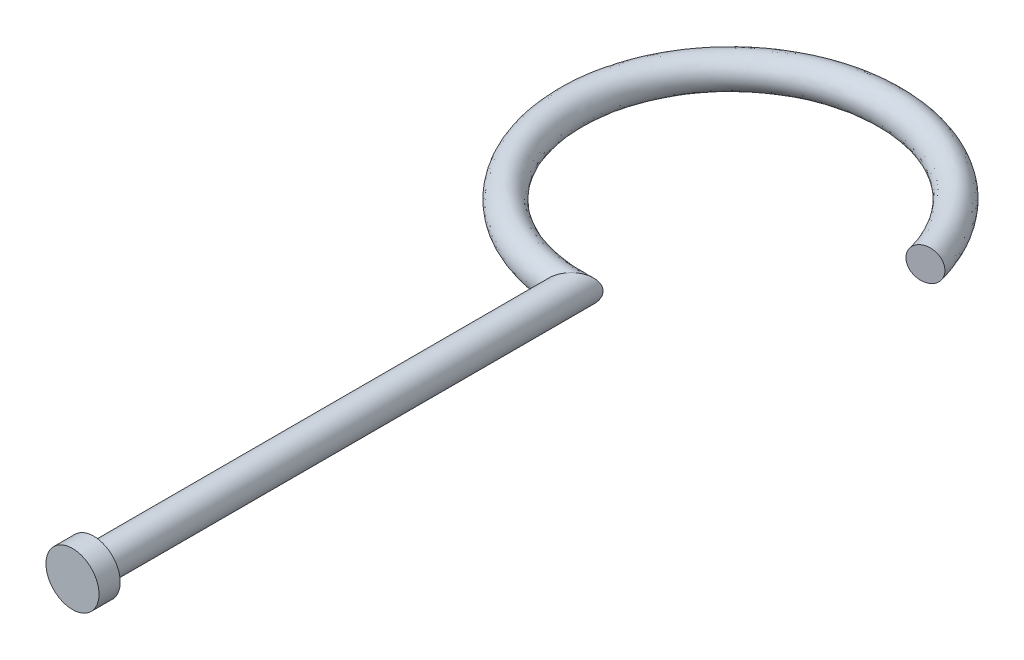
ISO-10303-21;
HEADER;
FILE_DESCRIPTION(('STEP AP214'),'2;1');
FILE_NAME('part.step','',(''),(''),'','','');
FILE_SCHEMA(('AUTOMOTIVE_DESIGN { 1 0 10303 214 1 1 1 1 }'));
ENDSEC;
DATA;
#1=APPLICATION_CONTEXT('core data for automotive mechanical design processes');
#2=APPLICATION_PROTOCOL_DEFINITION('international standard','automotive_design',2000,#1);
#3=PRODUCT_CONTEXT('',#1,'mechanical');
#4=PRODUCT('Part','Part','',(#3));
#5=PRODUCT_RELATED_PRODUCT_CATEGORY('part','',(#4));
#6=PRODUCT_DEFINITION_FORMATION('','',#4);
#7=PRODUCT_DEFINITION_CONTEXT('part definition',#1,'design');
#8=PRODUCT_DEFINITION('design','',#6,#7);
#9=PRODUCT_DEFINITION_SHAPE('','',#8);
#10=(LENGTH_UNIT() NAMED_UNIT(*) SI_UNIT(.MILLI.,.METRE.));
#11=(NAMED_UNIT(*) PLANE_ANGLE_UNIT() SI_UNIT($,.RADIAN.));
#12=(NAMED_UNIT(*) SI_UNIT($,.STERADIAN.) SOLID_ANGLE_UNIT());
#13=UNCERTAINTY_MEASURE_WITH_UNIT(LENGTH_MEASURE(1.E-05),#10,'distance_accuracy_value','');
#14=(GEOMETRIC_REPRESENTATION_CONTEXT(3) GLOBAL_UNCERTAINTY_ASSIGNED_CONTEXT((#13)) GLOBAL_UNIT_ASSIGNED_CONTEXT((#10,
#11,#12)) REPRESENTATION_CONTEXT('',''));
#15=CARTESIAN_POINT('',(0.,0.,0.));
#16=DIRECTION('',(0.,0.,1.));
#17=DIRECTION('',(1.,0.,0.));
#18=AXIS2_PLACEMENT_3D('',#15,#16,#17);
#19=CARTESIAN_POINT('',(14.488887394336,0.,-63.8822856765378));
#20=DIRECTION('',(-0.258819045102522,0.,-0.965925826289068));
#21=DIRECTION('',(-0.965925826289068,0.,0.258819045102522));
#22=AXIS2_PLACEMENT_3D('',#19,#20,#21);
#23=PLANE('',#22);
#24=CARTESIAN_POINT('',(14.488887394336,0.,-63.8822856765378));
#25=DIRECTION('',(-0.258819045102522,0.,-0.965925826289068));
#26=DIRECTION('',(-0.965925826289068,0.,0.258819045102522));
#27=AXIS2_PLACEMENT_3D('',#24,#25,#26);
#28=CIRCLE('',#27,1.5);
#29=CARTESIAN_POINT('',(13.0399986549024,0.,-63.494057108884));
#30=VERTEX_POINT('',#29);
#31=EDGE_CURVE('E68',#30,#30,#28,.T.);
#32=ORIENTED_EDGE('',*,*,#31,.F.);
#33=EDGE_LOOP('',(#32));
#34=FACE_BOUND('',#33,.T.);
#35=ADVANCED_FACE('F48',(#34),#23,.F.);
#36=CARTESIAN_POINT('',(0.,0.,-46.75));
#37=DIRECTION('',(0.,0.,1.));
#38=DIRECTION('',(1.,0.,0.));
#39=AXIS2_PLACEMENT_3D('',#36,#37,#38);
#40=CYLINDRICAL_SURFACE('',#39,1.5);
#41=CARTESIAN_POINT('',(0.,1.5,-45.));
#42=CARTESIAN_POINT('',(-0.00182570052334137,1.49999999062577,-44.9981743226474));
#43=CARTESIAN_POINT('',(-0.00365162674490686,1.49999665772791,-44.9963487601821));
#44=CARTESIAN_POINT('',(-0.117489931101232,1.49958150159555,-44.882554333358));
#45=CARTESIAN_POINT('',(-0.2303222860987,1.48665618338877,-44.7710447599424));
#46=CARTESIAN_POINT('',(-0.454272175423925,1.43418795758808,-44.552083630729));
#47=CARTESIAN_POINT('',(-0.565386324670156,1.39459802315094,-44.4446395992969));
#48=CARTESIAN_POINT('',(-0.747941856520892,1.30290906328869,-44.2697563871826));
#49=CARTESIAN_POINT('',(-0.82110231792989,1.25836622955377,-44.2001513550375));
#50=CARTESIAN_POINT('',(-0.961947015825986,1.15425374697726,-44.0669596414617));
#51=CARTESIAN_POINT('',(-1.02964254951718,1.09471620354097,-44.0033604957694));
#52=CARTESIAN_POINT('',(-1.14180970766872,0.975368406839608,-43.8985550442548));
#53=CARTESIAN_POINT('',(-1.18803773407626,0.918784356712649,-43.8555662520798));
#54=CARTESIAN_POINT('',(-1.27342229000397,0.796212607756046,-43.7764311839189));
#55=CARTESIAN_POINT('',(-1.3125868165649,0.73023569661826,-43.7402771675809));
#56=CARTESIAN_POINT('',(-1.37517690947598,0.602479851345222,-43.6826478737512));
#57=CARTESIAN_POINT('',(-1.40017100820055,0.542140537771701,-43.6596972688418));
#58=CARTESIAN_POINT('',(-1.44248947263902,0.416651098599183,-43.6208961136192));
#59=CARTESIAN_POINT('',(-1.45981845523413,0.3515038965759,-43.605041289281));
#60=CARTESIAN_POINT('',(-1.48569806271902,0.217646824409318,-43.5813804504727));
#61=CARTESIAN_POINT('',(-1.49419915162638,0.14891909886035,-43.5736198541117));
#62=CARTESIAN_POINT('',(-1.50156088721966,0.0105230323150633,-43.5668986619924));
#63=CARTESIAN_POINT('',(-1.50042454795043,-0.0591450077988932,-43.5679353149498));
#64=CARTESIAN_POINT('',(-1.48917422256102,-0.190532277039066,-43.5782087626424));
#65=CARTESIAN_POINT('',(-1.47990407430331,-0.252388682934932,-43.5866748107109));
#66=CARTESIAN_POINT('',(-1.45413471648743,-0.373244096349466,-43.6102421632536));
#67=CARTESIAN_POINT('',(-1.43763479232757,-0.432242820770358,-43.6253441236316));
#68=CARTESIAN_POINT('',(-1.39752974445329,-0.548495868971352,-43.6621228942192));
#69=CARTESIAN_POINT('',(-1.37366263863426,-0.605581314326749,-43.6840424074383));
#70=CARTESIAN_POINT('',(-1.32023815904093,-0.714607500605854,-43.7332319754427));
#71=CARTESIAN_POINT('',(-1.29067319794315,-0.76654124020763,-43.7605091655048));
#72=CARTESIAN_POINT('',(-1.23528297477604,-0.852030583466389,-43.8117648368011));
#73=CARTESIAN_POINT('',(-1.21047906466523,-0.88685742305851,-43.834761645565));
#74=CARTESIAN_POINT('',(-1.1588109674576,-0.95337754731034,-43.8827756593712));
#75=CARTESIAN_POINT('',(-1.13194860155675,-0.98507354638212,-43.9077910794856));
#76=CARTESIAN_POINT('',(-1.04866080811504,-1.07566305513392,-43.9855581206988));
#77=CARTESIAN_POINT('',(-0.989623530943115,-1.12992509835099,-44.0409485388455));
#78=CARTESIAN_POINT('',(-0.845490470355652,-1.24349263804372,-44.1769569756725));
#79=CARTESIAN_POINT('',(-0.758509137962945,-1.29791007116603,-44.2596167892086));
#80=CARTESIAN_POINT('',(-0.58020985343793,-1.38683041587513,-44.4304562635119));
#81=CARTESIAN_POINT('',(-0.488889657270904,-1.42132289834311,-44.518638788261));
#82=CARTESIAN_POINT('',(-0.26707263648279,-1.48212334379867,-44.7347735128394));
#83=CARTESIAN_POINT('',(-0.135634130107034,-1.49951509866013,-44.8644173627262));
#84=CARTESIAN_POINT('',(-0.00365159196749037,-1.49999666112362,-44.9963487916517));
#85=CARTESIAN_POINT('',(-0.00182566537006766,-1.49999999403207,-44.9981743544482));
#86=CARTESIAN_POINT('',(0.,-1.5,-45.));
#87=B_SPLINE_CURVE_WITH_KNOTS('',3,(#41,#42,#43,#44,#45,#46,#47,#48,#49,#50,#51,#52,#53,#54,#55,
#56,#57,#58,#59,#60,#61,#62,#63,#64,#65,#66,#67,#68,#69,#70,#71,#72,#73,#74,#75,#76,#77,#78,#79,
#80,#81,#82,#83,#84,#85,#86),.UNSPECIFIED.,.F.,.F.,(4,2,2,2,2,2,2,2,2,2,2,2,2,2,2,2,2,2,2,2,2,2,
4),(0.,0.00774597318277118,0.482869010134793,0.958832195993624,1.2888740020107,1.61821507035054,
1.87164184673813,2.12477987622606,2.33161459410611,2.53832456032036,2.74618827191288,
2.95398697783926,3.14248101672373,3.33099369084034,3.5271831640456,3.72363571317399,
3.86909372837129,4.01442450492916,4.30561829419841,4.69878445153205,5.09215621388458,
5.64423115695127,5.65197713013404),.UNSPECIFIED.);
#88=CARTESIAN_POINT('',(0.,1.5,-45.));
#89=VERTEX_POINT('',#88);
#90=CARTESIAN_POINT('',(0.,-1.5,-45.));
#91=VERTEX_POINT('',#90);
#92=EDGE_CURVE('E56',#89,#91,#87,.T.);
#93=ORIENTED_EDGE('',*,*,#92,.T.);
#94=CARTESIAN_POINT('',(0.,1.5,-45.));
#95=CARTESIAN_POINT('',(0.001825706863768,1.49999998989187,-45.0018256764312));
#96=CARTESIAN_POINT('',(0.00365146612070713,1.49999665701054,-45.0036514056455));
#97=CARTESIAN_POINT('',(0.120599320399947,1.49957024430724,-45.1205973603444));
#98=CARTESIAN_POINT('',(0.235901321708843,1.4859341178295,-45.2358990268935));
#99=CARTESIAN_POINT('',(0.463524269408615,1.43139410815715,-45.4635224668043));
#100=CARTESIAN_POINT('',(0.575838604769265,1.39043426275258,-45.5758376315238));
#101=CARTESIAN_POINT('',(0.760142278275618,1.29592445644127,-45.7601420861801));
#102=CARTESIAN_POINT('',(0.83406529974933,1.24991369989728,-45.8340652488425));
#103=CARTESIAN_POINT('',(0.976041292392693,1.14247301490139,-45.9760413431842));
#104=CARTESIAN_POINT('',(1.04410717856905,1.08107824292301,-46.0441071902788));
#105=CARTESIAN_POINT('',(1.15484548953128,0.959803898015554,-46.1548454808439));
#106=CARTESIAN_POINT('',(1.19953762618266,0.903623381138479,-46.1995376238736));
#107=CARTESIAN_POINT('',(1.2821472743883,0.781974462821362,-46.2821472766948));
#108=CARTESIAN_POINT('',(1.32007212858262,0.7165162679866,-46.3200721291351));
#109=CARTESIAN_POINT('',(1.38007136041,0.590949858775834,-46.3800713599689));
#110=CARTESIAN_POINT('',(1.40379995732907,0.532428311271976,-46.4037999572123));
#111=CARTESIAN_POINT('',(1.4441053813628,0.410670435316418,-46.4441053814793));
#112=CARTESIAN_POINT('',(1.46069467467753,0.347442553150832,-46.4606946747036));
#113=CARTESIAN_POINT('',(1.48196042918561,0.236631128045975,-46.481960429167));
#114=CARTESIAN_POINT('',(1.48869626595374,0.189826484297172,-46.488696265949));
#115=CARTESIAN_POINT('',(1.49771816991374,0.0953555933874125,-46.4977181699185));
#116=CARTESIAN_POINT('',(1.50000365125669,0.0476892336228323,-46.5000036512571));
#117=CARTESIAN_POINT('',(1.49999487961782,-0.0668775507450523,-46.4999948796172));
#118=CARTESIAN_POINT('',(1.49548790962511,-0.133800085633828,-46.4954879096317));
#119=CARTESIAN_POINT('',(1.47784073011761,-0.26534504488404,-46.4778407301109));
#120=CARTESIAN_POINT('',(1.46469020647034,-0.329964623948658,-46.4646902064431));
#121=CARTESIAN_POINT('',(1.43090224926875,-0.454601802665413,-46.4309022492957));
#122=CARTESIAN_POINT('',(1.41031589857866,-0.514647495680266,-46.4103158986798));
#123=CARTESIAN_POINT('',(1.36291764091198,-0.629544682950523,-46.3629176408107));
#124=CARTESIAN_POINT('',(1.3361034103921,-0.68439422780926,-46.3361034100142));
#125=CARTESIAN_POINT('',(1.26547213238862,-0.809727663998072,-46.2654721329211));
#126=CARTESIAN_POINT('',(1.21918683411052,-0.877428404744583,-46.2191868364754));
#127=CARTESIAN_POINT('',(1.11955048041993,-1.00148295189705,-46.1195504780497));
#128=CARTESIAN_POINT('',(1.06618374451279,-1.05781085631716,-46.0661837355562));
#129=CARTESIAN_POINT('',(0.930122123424716,-1.18179787720656,-45.9301221362889));
#130=CARTESIAN_POINT('',(0.844789880161585,-1.24367891143176,-45.8447899379537));
#131=CARTESIAN_POINT('',(0.668270243538632,-1.3468131564453,-45.6682697491874));
#132=CARTESIAN_POINT('',(0.577075316095577,-1.3880392006567,-45.5770742238307));
#133=CARTESIAN_POINT('',(0.327635851256353,-1.47307422600255,-45.3276335285106));
#134=CARTESIAN_POINT('',(0.166150375926888,-1.49940416860583,-45.1661476760354));
#135=CARTESIAN_POINT('',(0.00365140600613388,-1.49999665709837,-45.0036513455313));
#136=CARTESIAN_POINT('',(0.00182564627826326,-1.49999998987666,-45.0018256158461));
#137=CARTESIAN_POINT('',(0.,-1.5,-45.));
#138=B_SPLINE_CURVE_WITH_KNOTS('',3,(#94,#95,#96,#97,#98,#99,#100,#101,#102,#103,#104,#105,#106,
#107,#108,#109,#110,#111,#112,#113,#114,#115,#116,#117,#118,#119,#120,#121,#122,#123,#124,#125,
#126,#127,#128,#129,#130,#131,#132,#133,#134,#135,#136,#137),.UNSPECIFIED.,.F.,.F.,(4,2,2,2,2,2,
2,2,2,2,2,2,2,2,2,2,2,2,2,2,2,4),(0.,0.00774597314808132,0.496151109762397,0.985559641731343,
1.32714991491832,1.66796657349027,1.9208153044483,2.17338799869317,2.37498405365203,
2.57622665180979,2.7191252400906,2.86204263840295,3.06246451210251,3.26312597936895,
3.46243436798044,3.66181723582025,3.94276346053963,4.22434250503702,4.62877031946119,
5.03372867225369,5.7153616560804,5.72310762922849),.UNSPECIFIED.);
#139=EDGE_CURVE('E12',#89,#91,#138,.T.);
#140=ORIENTED_EDGE('',*,*,#139,.F.);
#141=EDGE_LOOP('',(#93,#140));
#142=FACE_BOUND('',#141,.T.);
#143=CARTESIAN_POINT('',(0.,0.,0.));
#144=DIRECTION('',(0.,0.,1.));
#145=DIRECTION('',(1.,0.,0.));
#146=AXIS2_PLACEMENT_3D('',#143,#144,#145);
#147=CIRCLE('',#146,1.5);
#148=CARTESIAN_POINT('',(1.50000000000002,0.,0.));
#149=VERTEX_POINT('',#148);
#150=EDGE_CURVE('E51',#149,#149,#147,.T.);
#151=ORIENTED_EDGE('',*,*,#150,.F.);
#152=EDGE_LOOP('',(#151));
#153=FACE_BOUND('',#152,.T.);
#154=ADVANCED_FACE('F63',(#142,#153),#40,.T.);
#155=CARTESIAN_POINT('',(13.0399986549024,0.,-63.494057108884));
#156=CARTESIAN_POINT('',(12.3915900467848,0.,-65.9139509781398));
#157=CARTESIAN_POINT('',(11.0556787281085,0.,-68.1418216762766));
#158=CARTESIAN_POINT('',(7.40131342650905,0.,-71.5645082865649));
#159=CARTESIAN_POINT('',(5.08907231112321,0.,-72.7522012146168));
#160=CARTESIAN_POINT('',(0.178366383312261,0.,-73.7290013562704));
#161=CARTESIAN_POINT('',(-2.41237617793993,0.,-73.5165725678967));
#162=CARTESIAN_POINT('',(-7.09837511593334,0.,-71.7528874545511));
#163=CARTESIAN_POINT('',(-9.1862625370105,0.,-70.2044046081781));
#164=CARTESIAN_POINT('',(-12.2342776508528,0.,-66.2321539750573));
#165=CARTESIAN_POINT('',(-13.1896121951202,0.,-63.8146327409798));
#166=CARTESIAN_POINT('',(-13.6803754250291,0.,-58.8318300479183));
#167=CARTESIAN_POINT('',(-13.2150323621459,0.,-56.2743842825794));
#168=CARTESIAN_POINT('',(-11.0005316592367,0.,-51.7838210815076));
#169=CARTESIAN_POINT('',(-9.2548563487766,0.,-49.8577652210747));
#170=CARTESIAN_POINT('',(-6.06594580128167,0.,-47.8747732135494));
#171=CARTESIAN_POINT('',(-4.91118289785517,0.,-47.362866504004));
#172=CARTESIAN_POINT('',(-3.10576539447972,0.,-46.8472080367964));
#173=CARTESIAN_POINT('',(-2.49195556552076,0.,-46.7172317433738));
#174=CARTESIAN_POINT('',(-1.56214768113099,0.,-46.5870346903721));
#175=CARTESIAN_POINT('',(-1.25069628392961,0.,-46.5544159312952));
#176=CARTESIAN_POINT('',(-0.626200605762738,0.,-46.5108990312765));
#177=CARTESIAN_POINT('',(-0.330554881620393,0.,-46.5000052192853));
#178=CARTESIAN_POINT('',(0.277083285934351,0.,-46.4999956250027));
#179=CARTESIAN_POINT('',(0.583333333333369,0.,-46.5));
#180=CARTESIAN_POINT('',(1.16666666666651,0.,-46.5));
#181=CARTESIAN_POINT('',(1.45833333333141,0.,-46.5));
#182=CARTESIAN_POINT('',(1.75,0.,-46.5));
#183=CARTESIAN_POINT('',(13.0399986549024,3.,-63.494057108884));
#184=CARTESIAN_POINT('',(12.3915900467848,3.,-65.9139509781398));
#185=CARTESIAN_POINT('',(11.0556787281085,3.,-68.1418216762766));
#186=CARTESIAN_POINT('',(7.40131342650906,3.,-71.5645082865649));
#187=CARTESIAN_POINT('',(5.08907231112321,3.,-72.7522012146168));
#188=CARTESIAN_POINT('',(0.178366383312261,3.,-73.7290013562704));
#189=CARTESIAN_POINT('',(-2.41237617793993,3.,-73.5165725678967));
#190=CARTESIAN_POINT('',(-7.09837511593334,3.,-71.7528874545511));
#191=CARTESIAN_POINT('',(-9.1862625370105,3.,-70.2044046081781));
#192=CARTESIAN_POINT('',(-12.2342776508528,3.,-66.2321539750573));
#193=CARTESIAN_POINT('',(-13.1896121951202,3.,-63.8146327409798));
#194=CARTESIAN_POINT('',(-13.6803754250291,3.,-58.8318300479183));
#195=CARTESIAN_POINT('',(-13.2150323621459,3.,-56.2743842825794));
#196=CARTESIAN_POINT('',(-11.0005316592367,3.,-51.7838210815076));
#197=CARTESIAN_POINT('',(-9.2548563487766,3.,-49.8577652210747));
#198=CARTESIAN_POINT('',(-6.06594580128167,3.,-47.8747732135494));
#199=CARTESIAN_POINT('',(-4.91118289785517,3.,-47.362866504004));
#200=CARTESIAN_POINT('',(-3.10576539447972,3.,-46.8472080367964));
#201=CARTESIAN_POINT('',(-2.49195556552076,3.,-46.7172317433738));
#202=CARTESIAN_POINT('',(-1.56214768113099,3.,-46.5870346903721));
#203=CARTESIAN_POINT('',(-1.25069628392961,3.,-46.5544159312952));
#204=CARTESIAN_POINT('',(-0.626200605762738,3.,-46.5108990312765));
#205=CARTESIAN_POINT('',(-0.330554881620393,3.,-46.5000052192853));
#206=CARTESIAN_POINT('',(0.277083285934351,3.,-46.4999956250027));
#207=CARTESIAN_POINT('',(0.583333333333369,3.,-46.5));
#208=CARTESIAN_POINT('',(1.16666666666651,3.,-46.5));
#209=CARTESIAN_POINT('',(1.45833333333141,3.,-46.5));
#210=CARTESIAN_POINT('',(1.75,3.,-46.5));
#211=CARTESIAN_POINT('',(15.9377761337696,3.,-64.2705142441916));
#212=CARTESIAN_POINT('',(15.1452767238444,3.,-67.2281623065489));
#213=CARTESIAN_POINT('',(13.5124962232378,3.,-69.9511153821159));
#214=CARTESIAN_POINT('',(9.04604974351696,3.,-74.1343990169127));
#215=CARTESIAN_POINT('',(6.21997726914843,3.,-75.5860237067817));
#216=CARTESIAN_POINT('',(0.218003357383784,3.,-76.7798905465249));
#217=CARTESIAN_POINT('',(-2.94845977302485,3.,-76.5202553607455));
#218=CARTESIAN_POINT('',(-8.67579180837586,3.,-74.3646402222463));
#219=CARTESIAN_POINT('',(-11.2276542118964,3.,-72.4720500766815));
#220=CARTESIAN_POINT('',(-14.9530060177144,3.,-67.6170770806063));
#221=CARTESIAN_POINT('',(-16.120637127366,3.,-64.6623289056248));
#222=CARTESIAN_POINT('',(-16.7204588528166,3.,-58.5722367252506));
#223=CARTESIAN_POINT('',(-16.1517062204053,3.,-55.4464696787211));
#224=CARTESIAN_POINT('',(-13.4450942501734,3.,-49.9580035440519));
#225=CARTESIAN_POINT('',(-11.3114910929556,3.,-47.6039352701981));
#226=CARTESIAN_POINT('',(-7.41393375711881,3.,-45.1802783721181));
#227=CARTESIAN_POINT('',(-6.00255687515042,3.,-44.5546146160108));
#228=CARTESIAN_POINT('',(-3.79593548214482,3.,-43.9243653783038));
#229=CARTESIAN_POINT('',(-3.04572346896981,3.,-43.7655054641262));
#230=CARTESIAN_POINT('',(-1.90929161027119,3.,-43.6063757326756));
#231=CARTESIAN_POINT('',(-1.52862879146964,3.,-43.566508360473));
#232=CARTESIAN_POINT('',(-0.765356295932082,3.,-43.5133210382258));
#233=CARTESIAN_POINT('',(-0.365350125704776,3.,-43.5000063791261));
#234=CARTESIAN_POINT('',(0.306249942068836,3.,-43.4999946527814));
#235=CARTESIAN_POINT('',(0.583333333333383,3.,-43.5));
#236=CARTESIAN_POINT('',(1.16666666666652,3.,-43.5));
#237=CARTESIAN_POINT('',(1.45833333333142,3.,-43.5));
#238=CARTESIAN_POINT('',(1.75000000000002,3.,-43.5));
#239=CARTESIAN_POINT('',(15.9377761337696,0.,-64.2705142441916));
#240=CARTESIAN_POINT('',(15.1452767238444,0.,-67.2281623065489));
#241=CARTESIAN_POINT('',(13.5124962232378,0.,-69.9511153821159));
#242=CARTESIAN_POINT('',(9.04604974351696,0.,-74.1343990169127));
#243=CARTESIAN_POINT('',(6.21997726914843,0.,-75.5860237067817));
#244=CARTESIAN_POINT('',(0.218003357383784,0.,-76.7798905465249));
#245=CARTESIAN_POINT('',(-2.94845977302485,0.,-76.5202553607455));
#246=CARTESIAN_POINT('',(-8.67579180837586,0.,-74.3646402222463));
#247=CARTESIAN_POINT('',(-11.2276542118964,0.,-72.4720500766815));
#248=CARTESIAN_POINT('',(-14.9530060177144,0.,-67.6170770806063));
#249=CARTESIAN_POINT('',(-16.120637127366,0.,-64.6623289056248));
#250=CARTESIAN_POINT('',(-16.7204588528166,0.,-58.5722367252506));
#251=CARTESIAN_POINT('',(-16.1517062204053,0.,-55.4464696787211));
#252=CARTESIAN_POINT('',(-13.4450942501734,0.,-49.9580035440519));
#253=CARTESIAN_POINT('',(-11.3114910929556,0.,-47.6039352701981));
#254=CARTESIAN_POINT('',(-7.41393375711881,0.,-45.1802783721181));
#255=CARTESIAN_POINT('',(-6.00255687515042,0.,-44.5546146160108));
#256=CARTESIAN_POINT('',(-3.79593548214482,0.,-43.9243653783038));
#257=CARTESIAN_POINT('',(-3.04572346896981,0.,-43.7655054641262));
#258=CARTESIAN_POINT('',(-1.90929161027119,0.,-43.6063757326756));
#259=CARTESIAN_POINT('',(-1.52862879146964,0.,-43.566508360473));
#260=CARTESIAN_POINT('',(-0.765356295932082,0.,-43.5133210382258));
#261=CARTESIAN_POINT('',(-0.365350125704776,0.,-43.5000063791261));
#262=CARTESIAN_POINT('',(0.306249942068836,0.,-43.4999946527814));
#263=CARTESIAN_POINT('',(0.583333333333383,0.,-43.5));
#264=CARTESIAN_POINT('',(1.16666666666652,0.,-43.5));
#265=CARTESIAN_POINT('',(1.45833333333142,0.,-43.5));
#266=CARTESIAN_POINT('',(1.75000000000002,0.,-43.5));
#267=CARTESIAN_POINT('',(15.9377761337696,-3.,-64.2705142441916));
#268=CARTESIAN_POINT('',(15.1452767238444,-3.,-67.2281623065489));
#269=CARTESIAN_POINT('',(13.5124962232378,-3.,-69.9511153821159));
#270=CARTESIAN_POINT('',(9.04604974351696,-3.,-74.1343990169127));
#271=CARTESIAN_POINT('',(6.21997726914843,-3.,-75.5860237067817));
#272=CARTESIAN_POINT('',(0.218003357383784,-3.,-76.7798905465249));
#273=CARTESIAN_POINT('',(-2.94845977302485,-3.,-76.5202553607455));
#274=CARTESIAN_POINT('',(-8.67579180837586,-3.,-74.3646402222463));
#275=CARTESIAN_POINT('',(-11.2276542118964,-3.,-72.4720500766815));
#276=CARTESIAN_POINT('',(-14.9530060177144,-3.,-67.6170770806063));
#277=CARTESIAN_POINT('',(-16.120637127366,-3.,-64.6623289056248));
#278=CARTESIAN_POINT('',(-16.7204588528166,-3.,-58.5722367252506));
#279=CARTESIAN_POINT('',(-16.1517062204053,-3.,-55.4464696787211));
#280=CARTESIAN_POINT('',(-13.4450942501734,-3.,-49.9580035440519));
#281=CARTESIAN_POINT('',(-11.3114910929556,-3.,-47.6039352701981));
#282=CARTESIAN_POINT('',(-7.41393375711881,-3.,-45.1802783721181));
#283=CARTESIAN_POINT('',(-6.00255687515042,-3.,-44.5546146160108));
#284=CARTESIAN_POINT('',(-3.79593548214482,-3.,-43.9243653783038));
#285=CARTESIAN_POINT('',(-3.04572346896981,-3.,-43.7655054641262));
#286=CARTESIAN_POINT('',(-1.90929161027119,-3.,-43.6063757326756));
#287=CARTESIAN_POINT('',(-1.52862879146964,-3.,-43.566508360473));
#288=CARTESIAN_POINT('',(-0.765356295932082,-3.,-43.5133210382258));
#289=CARTESIAN_POINT('',(-0.365350125704776,-3.,-43.5000063791261));
#290=CARTESIAN_POINT('',(0.306249942068836,-3.,-43.4999946527814));
#291=CARTESIAN_POINT('',(0.583333333333383,-3.,-43.5));
#292=CARTESIAN_POINT('',(1.16666666666652,-3.,-43.5));
#293=CARTESIAN_POINT('',(1.45833333333142,-3.,-43.5));
#294=CARTESIAN_POINT('',(1.75000000000002,-3.,-43.5));
#295=CARTESIAN_POINT('',(13.0399986549024,-3.,-63.494057108884));
#296=CARTESIAN_POINT('',(12.3915900467848,-3.,-65.9139509781398));
#297=CARTESIAN_POINT('',(11.0556787281085,-3.,-68.1418216762766));
#298=CARTESIAN_POINT('',(7.40131342650906,-3.,-71.5645082865649));
#299=CARTESIAN_POINT('',(5.08907231112321,-3.,-72.7522012146168));
#300=CARTESIAN_POINT('',(0.178366383312261,-3.,-73.7290013562704));
#301=CARTESIAN_POINT('',(-2.41237617793993,-3.,-73.5165725678967));
#302=CARTESIAN_POINT('',(-7.09837511593334,-3.,-71.7528874545511));
#303=CARTESIAN_POINT('',(-9.1862625370105,-3.,-70.2044046081781));
#304=CARTESIAN_POINT('',(-12.2342776508528,-3.,-66.2321539750573));
#305=CARTESIAN_POINT('',(-13.1896121951202,-3.,-63.8146327409798));
#306=CARTESIAN_POINT('',(-13.6803754250291,-3.,-58.8318300479183));
#307=CARTESIAN_POINT('',(-13.2150323621459,-3.,-56.2743842825794));
#308=CARTESIAN_POINT('',(-11.0005316592367,-3.,-51.7838210815076));
#309=CARTESIAN_POINT('',(-9.2548563487766,-3.,-49.8577652210747));
#310=CARTESIAN_POINT('',(-6.06594580128167,-3.,-47.8747732135494));
#311=CARTESIAN_POINT('',(-4.91118289785517,-3.,-47.362866504004));
#312=CARTESIAN_POINT('',(-3.10576539447972,-3.,-46.8472080367964));
#313=CARTESIAN_POINT('',(-2.49195556552076,-3.,-46.7172317433738));
#314=CARTESIAN_POINT('',(-1.56214768113099,-3.,-46.5870346903721));
#315=CARTESIAN_POINT('',(-1.25069628392961,-3.,-46.5544159312952));
#316=CARTESIAN_POINT('',(-0.626200605762738,-3.,-46.5108990312765));
#317=CARTESIAN_POINT('',(-0.330554881620393,-3.,-46.5000052192853));
#318=CARTESIAN_POINT('',(0.277083285934351,-3.,-46.4999956250027));
#319=CARTESIAN_POINT('',(0.583333333333369,-3.,-46.5));
#320=CARTESIAN_POINT('',(1.16666666666651,-3.,-46.5));
#321=CARTESIAN_POINT('',(1.45833333333141,-3.,-46.5));
#322=CARTESIAN_POINT('',(1.75,-3.,-46.5));
#323=CARTESIAN_POINT('',(13.0399986549024,0.,-63.494057108884));
#324=CARTESIAN_POINT('',(12.3915900467848,0.,-65.9139509781398));
#325=CARTESIAN_POINT('',(11.0556787281085,0.,-68.1418216762766));
#326=CARTESIAN_POINT('',(7.40131342650905,0.,-71.5645082865649));
#327=CARTESIAN_POINT('',(5.08907231112321,0.,-72.7522012146168));
#328=CARTESIAN_POINT('',(0.178366383312261,0.,-73.7290013562704));
#329=CARTESIAN_POINT('',(-2.41237617793993,0.,-73.5165725678967));
#330=CARTESIAN_POINT('',(-7.09837511593334,0.,-71.7528874545511));
#331=CARTESIAN_POINT('',(-9.1862625370105,0.,-70.2044046081781));
#332=CARTESIAN_POINT('',(-12.2342776508528,0.,-66.2321539750573));
#333=CARTESIAN_POINT('',(-13.1896121951202,0.,-63.8146327409798));
#334=CARTESIAN_POINT('',(-13.6803754250291,0.,-58.8318300479183));
#335=CARTESIAN_POINT('',(-13.2150323621459,0.,-56.2743842825794));
#336=CARTESIAN_POINT('',(-11.0005316592367,0.,-51.7838210815076));
#337=CARTESIAN_POINT('',(-9.2548563487766,0.,-49.8577652210747));
#338=CARTESIAN_POINT('',(-6.06594580128167,0.,-47.8747732135494));
#339=CARTESIAN_POINT('',(-4.91118289785517,0.,-47.362866504004));
#340=CARTESIAN_POINT('',(-3.10576539447972,0.,-46.8472080367964));
#341=CARTESIAN_POINT('',(-2.49195556552076,0.,-46.7172317433738));
#342=CARTESIAN_POINT('',(-1.56214768113099,0.,-46.5870346903721));
#343=CARTESIAN_POINT('',(-1.25069628392961,0.,-46.5544159312952));
#344=CARTESIAN_POINT('',(-0.626200605762738,0.,-46.5108990312765));
#345=CARTESIAN_POINT('',(-0.330554881620393,0.,-46.5000052192853));
#346=CARTESIAN_POINT('',(0.277083285934351,0.,-46.4999956250027));
#347=CARTESIAN_POINT('',(0.583333333333369,0.,-46.5));
#348=CARTESIAN_POINT('',(1.16666666666651,0.,-46.5));
#349=CARTESIAN_POINT('',(1.45833333333141,0.,-46.5));
#350=CARTESIAN_POINT('',(1.75,0.,-46.5));
#351=(BOUNDED_SURFACE() B_SPLINE_SURFACE(3,3,((#155,#156,#157,#158,#159,#160,#161,#162,#163,
#164,#165,#166,#167,#168,#169,#170,#171,#172,#173,#174,#175,#176,#177,#178,#179,#180,#181,#182),
(#183,#184,#185,#186,#187,#188,#189,#190,#191,#192,#193,#194,#195,#196,#197,#198,#199,#200,#201,
#202,#203,#204,#205,#206,#207,#208,#209,#210),(#211,#212,#213,#214,#215,#216,#217,#218,#219,
#220,#221,#222,#223,#224,#225,#226,#227,#228,#229,#230,#231,#232,#233,#234,#235,#236,#237,#238),
(#239,#240,#241,#242,#243,#244,#245,#246,#247,#248,#249,#250,#251,#252,#253,#254,#255,#256,#257,
#258,#259,#260,#261,#262,#263,#264,#265,#266),(#267,#268,#269,#270,#271,#272,#273,#274,#275,
#276,#277,#278,#279,#280,#281,#282,#283,#284,#285,#286,#287,#288,#289,#290,#291,#292,#293,#294),
(#295,#296,#297,#298,#299,#300,#301,#302,#303,#304,#305,#306,#307,#308,#309,#310,#311,#312,#313,
#314,#315,#316,#317,#318,#319,#320,#321,#322),(#323,#324,#325,#326,#327,#328,#329,#330,#331,
#332,#333,#334,#335,#336,#337,#338,#339,#340,#341,#342,#343,#344,#345,#346,#347,#348,#349,
#350)),.UNSPECIFIED.,.T.,.F.,.F.) B_SPLINE_SURFACE_WITH_KNOTS((4,3,4),(4,2,2,2,2,2,2,2,2,2,2,2,
2,4),(0.,0.5,1.),(0.,0.125,0.25,0.375,0.5,0.625,0.75,0.875,0.9375,0.96875,0.984375,1.,
1.01309745093311,1.02619490186623),
.UNSPECIFIED.) GEOMETRIC_REPRESENTATION_ITEM() RATIONAL_B_SPLINE_SURFACE(((1.,1.,1.,1.,1.,1.,1.,
1.,1.,1.,1.,1.,1.,1.,1.,1.,1.,1.,1.,1.,1.,1.,1.,1.,1.,1.,1.,1.),(0.333333333333333,
0.333333333333333,0.333333333333333,0.333333333333333,0.333333333333333,0.333333333333333,
0.333333333333333,0.333333333333333,0.333333333333333,0.333333333333333,0.333333333333333,
0.333333333333333,0.333333333333333,0.333333333333333,0.333333333333333,0.333333333333333,
0.333333333333333,0.333333333333333,0.333333333333333,0.333333333333333,0.333333333333333,
0.333333333333333,0.333333333333333,0.333333333333333,0.333333333333333,0.333333333333333,
0.333333333333333,0.333333333333333),(0.333333333333333,0.333333333333333,0.333333333333333,
0.333333333333333,0.333333333333333,0.333333333333333,0.333333333333333,0.333333333333333,
0.333333333333333,0.333333333333333,0.333333333333333,0.333333333333333,0.333333333333333,
0.333333333333333,0.333333333333333,0.333333333333333,0.333333333333333,0.333333333333333,
0.333333333333333,0.333333333333333,0.333333333333333,0.333333333333333,0.333333333333333,
0.333333333333333,0.333333333333333,0.333333333333333,0.333333333333333,0.333333333333333),(1.,
1.,1.,1.,1.,1.,1.,1.,1.,1.,1.,1.,1.,1.,1.,1.,1.,1.,1.,1.,1.,1.,1.,1.,1.,1.,1.,1.),
(0.333333333333333,0.333333333333333,0.333333333333333,0.333333333333333,0.333333333333333,
0.333333333333333,0.333333333333333,0.333333333333333,0.333333333333333,0.333333333333333,
0.333333333333333,0.333333333333333,0.333333333333333,0.333333333333333,0.333333333333333,
0.333333333333333,0.333333333333333,0.333333333333333,0.333333333333333,0.333333333333333,
0.333333333333333,0.333333333333333,0.333333333333333,0.333333333333333,0.333333333333333,
0.333333333333333,0.333333333333333,0.333333333333333),(0.333333333333333,0.333333333333333,
0.333333333333333,0.333333333333333,0.333333333333333,0.333333333333333,0.333333333333333,
0.333333333333333,0.333333333333333,0.333333333333333,0.333333333333333,0.333333333333333,
0.333333333333333,0.333333333333333,0.333333333333333,0.333333333333333,0.333333333333333,
0.333333333333333,0.333333333333333,0.333333333333333,0.333333333333333,0.333333333333333,
0.333333333333333,0.333333333333333,0.333333333333333,0.333333333333333,0.333333333333333,
0.333333333333333),(1.,1.,1.,1.,1.,1.,1.,1.,1.,1.,1.,1.,1.,1.,1.,1.,1.,1.,1.,1.,1.,1.,1.,1.,1.,
1.,1.,1.))) REPRESENTATION_ITEM('') SURFACE());
#352=ORIENTED_EDGE('',*,*,#92,.F.);
#353=ORIENTED_EDGE('',*,*,#139,.T.);
#354=EDGE_LOOP('',(#352,#353));
#355=FACE_BOUND('',#354,.T.);
#356=ORIENTED_EDGE('',*,*,#31,.T.);
#357=EDGE_LOOP('',(#356));
#358=FACE_BOUND('',#357,.T.);
#359=ADVANCED_FACE('F66',(#355,#358),#351,.T.);
#360=CARTESIAN_POINT('',(0.,0.,2.));
#361=DIRECTION('',(0.,0.,-1.));
#362=DIRECTION('',(-1.,0.,0.));
#363=AXIS2_PLACEMENT_3D('',#360,#361,#362);
#364=CYLINDRICAL_SURFACE('',#363,2.5);
#365=CARTESIAN_POINT('',(0.,0.,2.));
#366=DIRECTION('',(0.,0.,1.));
#367=DIRECTION('',(1.,0.,0.));
#368=AXIS2_PLACEMENT_3D('',#365,#366,#367);
#369=CIRCLE('',#368,2.5);
#370=CARTESIAN_POINT('',(2.5,0.,2.));
#371=VERTEX_POINT('',#370);
#372=EDGE_CURVE('E119',#371,#371,#369,.T.);
#373=ORIENTED_EDGE('',*,*,#372,.F.);
#374=EDGE_LOOP('',(#373));
#375=FACE_BOUND('',#374,.T.);
#376=CARTESIAN_POINT('',(0.,0.,0.));
#377=DIRECTION('',(0.,0.,1.));
#378=DIRECTION('',(1.,0.,0.));
#379=AXIS2_PLACEMENT_3D('',#376,#377,#378);
#380=CIRCLE('',#379,2.5);
#381=CARTESIAN_POINT('',(2.5,0.,0.));
#382=VERTEX_POINT('',#381);
#383=EDGE_CURVE('E118',#382,#382,#380,.T.);
#384=ORIENTED_EDGE('',*,*,#383,.T.);
#385=EDGE_LOOP('',(#384));
#386=FACE_BOUND('',#385,.T.);
#387=ADVANCED_FACE('F92',(#375,#386),#364,.T.);
#388=CARTESIAN_POINT('',(0.,0.,2.));
#389=DIRECTION('',(0.,0.,1.));
#390=DIRECTION('',(1.,0.,0.));
#391=AXIS2_PLACEMENT_3D('',#388,#389,#390);
#392=PLANE('',#391);
#393=ORIENTED_EDGE('',*,*,#372,.T.);
#394=EDGE_LOOP('',(#393));
#395=FACE_BOUND('',#394,.T.);
#396=ADVANCED_FACE('F98',(#395),#392,.T.);
#397=CARTESIAN_POINT('',(0.,0.,0.));
#398=DIRECTION('',(0.,0.,1.));
#399=DIRECTION('',(1.,0.,0.));
#400=AXIS2_PLACEMENT_3D('',#397,#398,#399);
#401=PLANE('',#400);
#402=ORIENTED_EDGE('',*,*,#150,.T.);
#403=EDGE_LOOP('',(#402));
#404=FACE_BOUND('',#403,.T.);
#405=ORIENTED_EDGE('',*,*,#383,.F.);
#406=EDGE_LOOP('',(#405));
#407=FACE_BOUND('',#406,.T.);
#408=ADVANCED_FACE('F103',(#404,#407),#401,.F.);
#409=CLOSED_SHELL('',(#35,#154,#359,#387,#396,#408));
#410=MANIFOLD_SOLID_BREP('B2',#409);
#411=ADVANCED_BREP_SHAPE_REPRESENTATION('',(#18,#410),#14);
#412=SHAPE_DEFINITION_REPRESENTATION(#9,#411);
ENDSEC;
END-ISO-10303-21;
